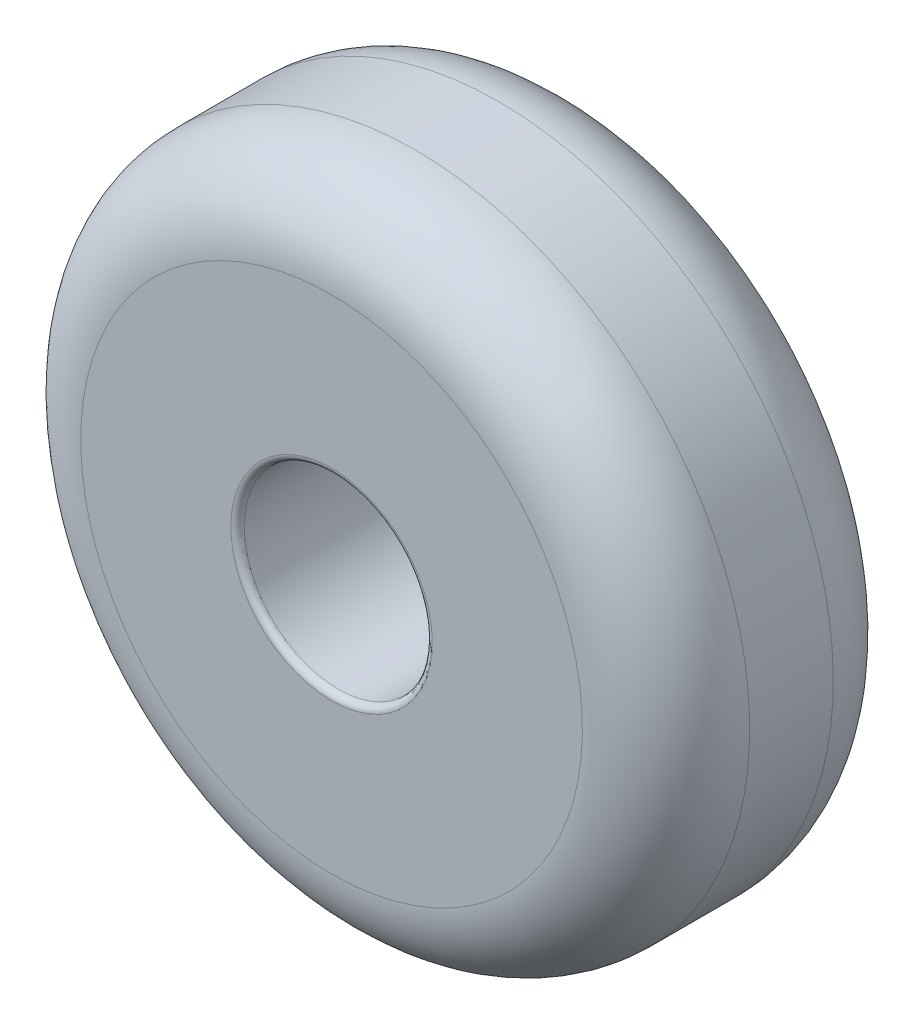
ISO-10303-21;
HEADER;
FILE_DESCRIPTION(('STEP AP214'),'2;1');
FILE_NAME('part.step','',(''),(''),'','','');
FILE_SCHEMA(('AUTOMOTIVE_DESIGN { 1 0 10303 214 1 1 1 1 }'));
ENDSEC;
DATA;
#1=APPLICATION_CONTEXT('core data for automotive mechanical design processes');
#2=APPLICATION_PROTOCOL_DEFINITION('international standard','automotive_design',2000,#1);
#3=PRODUCT_CONTEXT('',#1,'mechanical');
#4=PRODUCT('Part','Part','',(#3));
#5=PRODUCT_RELATED_PRODUCT_CATEGORY('part','',(#4));
#6=PRODUCT_DEFINITION_FORMATION('','',#4);
#7=PRODUCT_DEFINITION_CONTEXT('part definition',#1,'design');
#8=PRODUCT_DEFINITION('design','',#6,#7);
#9=PRODUCT_DEFINITION_SHAPE('','',#8);
#10=(LENGTH_UNIT() NAMED_UNIT(*) SI_UNIT(.MILLI.,.METRE.));
#11=(NAMED_UNIT(*) PLANE_ANGLE_UNIT() SI_UNIT($,.RADIAN.));
#12=(NAMED_UNIT(*) SI_UNIT($,.STERADIAN.) SOLID_ANGLE_UNIT());
#13=UNCERTAINTY_MEASURE_WITH_UNIT(LENGTH_MEASURE(1.E-05),#10,'distance_accuracy_value','');
#14=(GEOMETRIC_REPRESENTATION_CONTEXT(3) GLOBAL_UNCERTAINTY_ASSIGNED_CONTEXT((#13)) GLOBAL_UNIT_ASSIGNED_CONTEXT((#10,
#11,#12)) REPRESENTATION_CONTEXT('',''));
#15=CARTESIAN_POINT('',(0.,0.,0.));
#16=DIRECTION('',(0.,0.,1.));
#17=DIRECTION('',(1.,0.,0.));
#18=AXIS2_PLACEMENT_3D('',#15,#16,#17);
#19=CARTESIAN_POINT('',(0.,12.7,4.7625));
#20=DIRECTION('',(0.,0.,1.));
#21=DIRECTION('',(0.,-1.,0.));
#22=AXIS2_PLACEMENT_3D('',#19,#20,#21);
#23=PLANE('',#22);
#24=CARTESIAN_POINT('',(0.,0.,4.7625));
#25=DIRECTION('',(0.,0.,1.));
#26=DIRECTION('',(0.,-1.,0.));
#27=AXIS2_PLACEMENT_3D('',#24,#25,#26);
#28=CIRCLE('',#27,3.825875);
#29=CARTESIAN_POINT('',(0.,-3.825875,4.7625));
#30=VERTEX_POINT('',#29);
#31=EDGE_CURVE('E10',#30,#30,#28,.F.);
#32=ORIENTED_EDGE('',*,*,#31,.T.);
#33=EDGE_LOOP('',(#32));
#34=FACE_BOUND('',#33,.T.);
#35=CARTESIAN_POINT('',(0.,0.,4.7625));
#36=DIRECTION('',(0.,0.,1.));
#37=DIRECTION('',(0.,-1.,0.));
#38=AXIS2_PLACEMENT_3D('',#35,#36,#37);
#39=CIRCLE('',#38,9.525);
#40=CARTESIAN_POINT('',(0.,-9.525,4.7625));
#41=VERTEX_POINT('',#40);
#42=EDGE_CURVE('E52',#41,#41,#39,.T.);
#43=ORIENTED_EDGE('',*,*,#42,.T.);
#44=EDGE_LOOP('',(#43));
#45=FACE_BOUND('',#44,.T.);
#46=ADVANCED_FACE('F32',(#34,#45),#23,.T.);
#47=CARTESIAN_POINT('',(0.,0.,0.));
#48=DIRECTION('',(0.,0.,-1.));
#49=DIRECTION('',(0.,1.,0.));
#50=AXIS2_PLACEMENT_3D('',#47,#48,#49);
#51=CYLINDRICAL_SURFACE('',#50,3.571875);
#52=CARTESIAN_POINT('',(0.,0.,-4.5085));
#53=DIRECTION('',(0.,0.,-1.));
#54=DIRECTION('',(0.,1.,0.));
#55=AXIS2_PLACEMENT_3D('',#52,#53,#54);
#56=CIRCLE('',#55,3.571875);
#57=CARTESIAN_POINT('',(0.,3.571875,-4.5085));
#58=VERTEX_POINT('',#57);
#59=EDGE_CURVE('E43',#58,#58,#56,.T.);
#60=ORIENTED_EDGE('',*,*,#59,.T.);
#61=EDGE_LOOP('',(#60));
#62=FACE_BOUND('',#61,.T.);
#63=CARTESIAN_POINT('',(0.,0.,4.5085));
#64=DIRECTION('',(0.,0.,1.));
#65=DIRECTION('',(0.,-1.,0.));
#66=AXIS2_PLACEMENT_3D('',#63,#64,#65);
#67=CIRCLE('',#66,3.571875);
#68=CARTESIAN_POINT('',(0.,-3.571875,4.5085));
#69=VERTEX_POINT('',#68);
#70=EDGE_CURVE('E47',#69,#69,#67,.T.);
#71=ORIENTED_EDGE('',*,*,#70,.T.);
#72=EDGE_LOOP('',(#71));
#73=FACE_BOUND('',#72,.T.);
#74=ADVANCED_FACE('F85',(#62,#73),#51,.F.);
#75=CARTESIAN_POINT('',(0.,3.571875,-4.7625));
#76=DIRECTION('',(0.,0.,-1.));
#77=DIRECTION('',(0.,1.,0.));
#78=AXIS2_PLACEMENT_3D('',#75,#76,#77);
#79=PLANE('',#78);
#80=CARTESIAN_POINT('',(0.,0.,-4.7625));
#81=DIRECTION('',(0.,0.,-1.));
#82=DIRECTION('',(0.,1.,0.));
#83=AXIS2_PLACEMENT_3D('',#80,#81,#82);
#84=CIRCLE('',#83,3.825875);
#85=CARTESIAN_POINT('',(0.,3.825875,-4.7625));
#86=VERTEX_POINT('',#85);
#87=EDGE_CURVE('E39',#86,#86,#84,.F.);
#88=ORIENTED_EDGE('',*,*,#87,.T.);
#89=EDGE_LOOP('',(#88));
#90=FACE_BOUND('',#89,.T.);
#91=CARTESIAN_POINT('',(0.,0.,-4.7625));
#92=DIRECTION('',(0.,0.,-1.));
#93=DIRECTION('',(0.,1.,0.));
#94=AXIS2_PLACEMENT_3D('',#91,#92,#93);
#95=CIRCLE('',#94,9.525);
#96=CARTESIAN_POINT('',(0.,9.525,-4.7625));
#97=VERTEX_POINT('',#96);
#98=EDGE_CURVE('E61',#97,#97,#95,.T.);
#99=ORIENTED_EDGE('',*,*,#98,.T.);
#100=EDGE_LOOP('',(#99));
#101=FACE_BOUND('',#100,.T.);
#102=ADVANCED_FACE('F65',(#90,#101),#79,.T.);
#103=CARTESIAN_POINT('',(0.,0.,0.));
#104=DIRECTION('',(0.,0.,-1.));
#105=DIRECTION('',(0.,1.,0.));
#106=AXIS2_PLACEMENT_3D('',#103,#104,#105);
#107=CYLINDRICAL_SURFACE('',#106,12.7);
#108=CARTESIAN_POINT('',(0.,0.,-1.5875));
#109=DIRECTION('',(0.,0.,-1.));
#110=DIRECTION('',(0.,1.,0.));
#111=AXIS2_PLACEMENT_3D('',#108,#109,#110);
#112=CIRCLE('',#111,12.7);
#113=CARTESIAN_POINT('',(0.,12.7,-1.5875));
#114=VERTEX_POINT('',#113);
#115=EDGE_CURVE('E55',#114,#114,#112,.F.);
#116=ORIENTED_EDGE('',*,*,#115,.T.);
#117=EDGE_LOOP('',(#116));
#118=FACE_BOUND('',#117,.T.);
#119=CARTESIAN_POINT('',(0.,0.,1.5875));
#120=DIRECTION('',(0.,0.,1.));
#121=DIRECTION('',(0.,-1.,0.));
#122=AXIS2_PLACEMENT_3D('',#119,#120,#121);
#123=CIRCLE('',#122,12.7);
#124=CARTESIAN_POINT('',(0.,-12.7,1.5875));
#125=VERTEX_POINT('',#124);
#126=EDGE_CURVE('E58',#125,#125,#123,.F.);
#127=ORIENTED_EDGE('',*,*,#126,.T.);
#128=EDGE_LOOP('',(#127));
#129=FACE_BOUND('',#128,.T.);
#130=ADVANCED_FACE('F70',(#118,#129),#107,.T.);
#131=CARTESIAN_POINT('',(0.,0.,-1.5875));
#132=DIRECTION('',(0.,0.,-1.));
#133=DIRECTION('',(0.,1.,0.));
#134=AXIS2_PLACEMENT_3D('',#131,#132,#133);
#135=TOROIDAL_SURFACE('',#134,9.525,3.175);
#136=ORIENTED_EDGE('',*,*,#115,.F.);
#137=EDGE_LOOP('',(#136));
#138=FACE_BOUND('',#137,.T.);
#139=ORIENTED_EDGE('',*,*,#98,.F.);
#140=EDGE_LOOP('',(#139));
#141=FACE_BOUND('',#140,.T.);
#142=ADVANCED_FACE('F67',(#138,#141),#135,.T.);
#143=CARTESIAN_POINT('',(0.,0.,1.5875));
#144=DIRECTION('',(0.,0.,1.));
#145=DIRECTION('',(0.,-1.,0.));
#146=AXIS2_PLACEMENT_3D('',#143,#144,#145);
#147=TOROIDAL_SURFACE('',#146,9.525,3.175);
#148=ORIENTED_EDGE('',*,*,#42,.F.);
#149=EDGE_LOOP('',(#148));
#150=FACE_BOUND('',#149,.T.);
#151=ORIENTED_EDGE('',*,*,#126,.F.);
#152=EDGE_LOOP('',(#151));
#153=FACE_BOUND('',#152,.T.);
#154=ADVANCED_FACE('F69',(#150,#153),#147,.T.);
#155=CARTESIAN_POINT('',(0.,0.,-4.5085));
#156=DIRECTION('',(0.,0.,-1.));
#157=DIRECTION('',(0.,1.,0.));
#158=AXIS2_PLACEMENT_3D('',#155,#156,#157);
#159=TOROIDAL_SURFACE('',#158,3.825875,0.254);
#160=ORIENTED_EDGE('',*,*,#87,.F.);
#161=EDGE_LOOP('',(#160));
#162=FACE_BOUND('',#161,.T.);
#163=ORIENTED_EDGE('',*,*,#59,.F.);
#164=EDGE_LOOP('',(#163));
#165=FACE_BOUND('',#164,.T.);
#166=ADVANCED_FACE('F77',(#162,#165),#159,.T.);
#167=CARTESIAN_POINT('',(0.,0.,4.5085));
#168=DIRECTION('',(0.,0.,1.));
#169=DIRECTION('',(0.,-1.,0.));
#170=AXIS2_PLACEMENT_3D('',#167,#168,#169);
#171=TOROIDAL_SURFACE('',#170,3.825875,0.254);
#172=ORIENTED_EDGE('',*,*,#70,.F.);
#173=EDGE_LOOP('',(#172));
#174=FACE_BOUND('',#173,.T.);
#175=ORIENTED_EDGE('',*,*,#31,.F.);
#176=EDGE_LOOP('',(#175));
#177=FACE_BOUND('',#176,.T.);
#178=ADVANCED_FACE('F34',(#174,#177),#171,.T.);
#179=CLOSED_SHELL('',(#46,#74,#102,#130,#142,#154,#166,#178));
#180=MANIFOLD_SOLID_BREP('B2',#179);
#181=ADVANCED_BREP_SHAPE_REPRESENTATION('',(#18,#180),#14);
#182=SHAPE_DEFINITION_REPRESENTATION(#9,#181);
ENDSEC;
END-ISO-10303-21;
